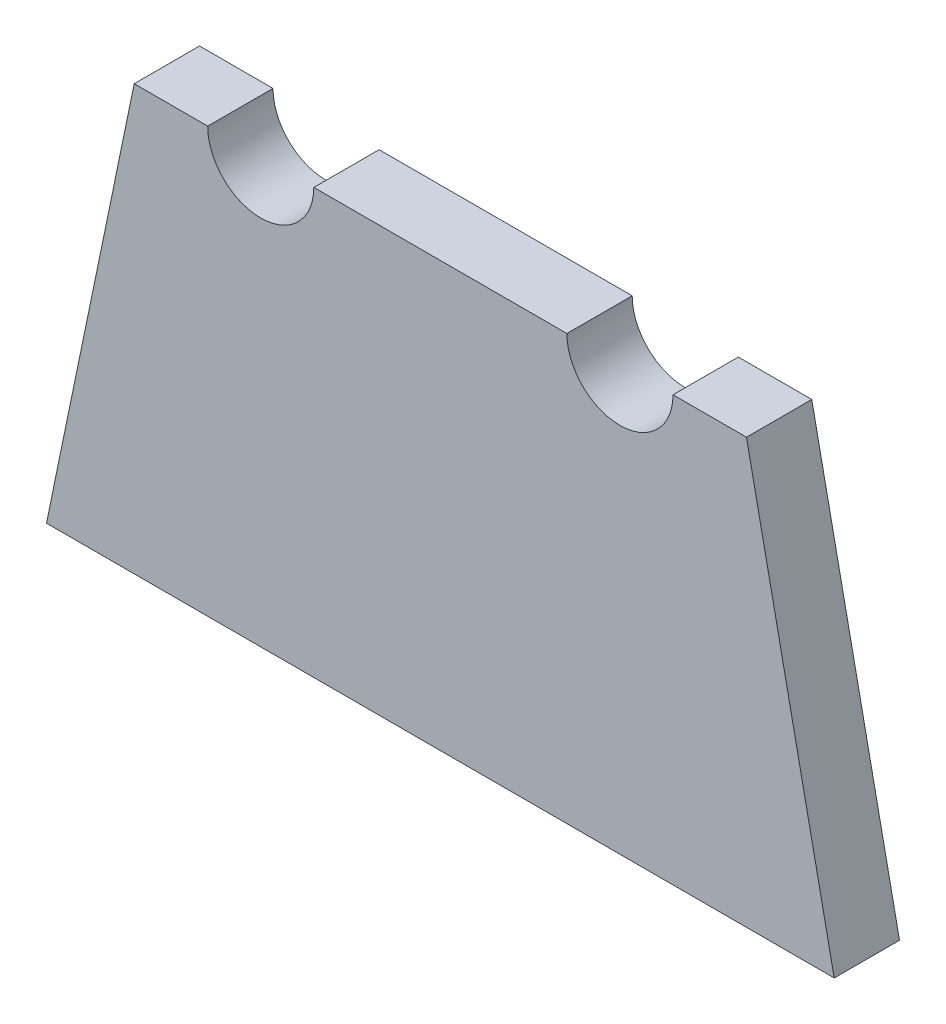
ISO-10303-21;
HEADER;
FILE_DESCRIPTION(('STEP AP214'),'2;1');
FILE_NAME('part.step','',(''),(''),'','','');
FILE_SCHEMA(('AUTOMOTIVE_DESIGN { 1 0 10303 214 1 1 1 1 }'));
ENDSEC;
DATA;
#1=APPLICATION_CONTEXT('core data for automotive mechanical design processes');
#2=APPLICATION_PROTOCOL_DEFINITION('international standard','automotive_design',2000,#1);
#3=PRODUCT_CONTEXT('',#1,'mechanical');
#4=PRODUCT('Part','Part','',(#3));
#5=PRODUCT_RELATED_PRODUCT_CATEGORY('part','',(#4));
#6=PRODUCT_DEFINITION_FORMATION('','',#4);
#7=PRODUCT_DEFINITION_CONTEXT('part definition',#1,'design');
#8=PRODUCT_DEFINITION('design','',#6,#7);
#9=PRODUCT_DEFINITION_SHAPE('','',#8);
#10=(LENGTH_UNIT() NAMED_UNIT(*) SI_UNIT(.MILLI.,.METRE.));
#11=(NAMED_UNIT(*) PLANE_ANGLE_UNIT() SI_UNIT($,.RADIAN.));
#12=(NAMED_UNIT(*) SI_UNIT($,.STERADIAN.) SOLID_ANGLE_UNIT());
#13=UNCERTAINTY_MEASURE_WITH_UNIT(LENGTH_MEASURE(1.E-05),#10,'distance_accuracy_value','');
#14=(GEOMETRIC_REPRESENTATION_CONTEXT(3) GLOBAL_UNCERTAINTY_ASSIGNED_CONTEXT((#13)) GLOBAL_UNIT_ASSIGNED_CONTEXT((#10,
#11,#12)) REPRESENTATION_CONTEXT('',''));
#15=CARTESIAN_POINT('',(0.,0.,0.));
#16=DIRECTION('',(0.,0.,1.));
#17=DIRECTION('',(1.,0.,0.));
#18=AXIS2_PLACEMENT_3D('',#15,#16,#17);
#19=CARTESIAN_POINT('',(-4.825,-2.89543156892719,0.8));
#20=DIRECTION('',(0.,1.,0.));
#21=DIRECTION('',(-1.,0.,0.));
#22=AXIS2_PLACEMENT_3D('',#19,#20,#21);
#23=PLANE('',#22);
#24=DIRECTION('',(1.,0.,0.));
#25=VECTOR('',#24,1.);
#26=CARTESIAN_POINT('',(-4.825,-2.89543156892719,0.));
#27=LINE('',#26,#25);
#28=CARTESIAN_POINT('',(-4.825,-2.89543156892719,0.));
#29=VERTEX_POINT('',#28);
#30=CARTESIAN_POINT('',(4.825,-2.89543156892719,0.));
#31=VERTEX_POINT('',#30);
#32=EDGE_CURVE('E130',#29,#31,#27,.T.);
#33=ORIENTED_EDGE('',*,*,#32,.T.);
#34=DIRECTION('',(0.,0.,-1.));
#35=VECTOR('',#34,1.);
#36=CARTESIAN_POINT('',(4.825,-2.89543156892719,0.8));
#37=LINE('',#36,#35);
#38=CARTESIAN_POINT('',(4.825,-2.89543156892719,0.8));
#39=VERTEX_POINT('',#38);
#40=EDGE_CURVE('E11',#39,#31,#37,.T.);
#41=ORIENTED_EDGE('',*,*,#40,.F.);
#42=DIRECTION('',(1.,0.,0.));
#43=VECTOR('',#42,1.);
#44=CARTESIAN_POINT('',(-4.825,-2.89543156892719,0.8));
#45=LINE('',#44,#43);
#46=CARTESIAN_POINT('',(-4.825,-2.89543156892719,0.8));
#47=VERTEX_POINT('',#46);
#48=EDGE_CURVE('E144',#47,#39,#45,.T.);
#49=ORIENTED_EDGE('',*,*,#48,.F.);
#50=DIRECTION('',(0.,0.,-1.));
#51=VECTOR('',#50,1.);
#52=CARTESIAN_POINT('',(-4.825,-2.89543156892719,0.8));
#53=LINE('',#52,#51);
#54=EDGE_CURVE('E126',#47,#29,#53,.T.);
#55=ORIENTED_EDGE('',*,*,#54,.T.);
#56=EDGE_LOOP('',(#33,#41,#49,#55));
#57=FACE_BOUND('',#56,.T.);
#58=ADVANCED_FACE('F34',(#57),#23,.F.);
#59=CARTESIAN_POINT('',(4.825,-2.89543156892719,0.8));
#60=DIRECTION('',(-0.979292617878937,-0.202449916196127,0.));
#61=DIRECTION('',(0.202449916196127,-0.979292617878937,0.));
#62=AXIS2_PLACEMENT_3D('',#59,#60,#61);
#63=PLANE('',#62);
#64=DIRECTION('',(-0.202449916196127,0.979292617878937,0.));
#65=VECTOR('',#64,1.);
#66=CARTESIAN_POINT('',(4.825,-2.89543156892719,0.));
#67=LINE('',#66,#65);
#68=CARTESIAN_POINT('',(3.75,2.30456843107281,0.));
#69=VERTEX_POINT('',#68);
#70=EDGE_CURVE('E133',#31,#69,#67,.T.);
#71=ORIENTED_EDGE('',*,*,#70,.T.);
#72=DIRECTION('',(0.,0.,-1.));
#73=VECTOR('',#72,1.);
#74=CARTESIAN_POINT('',(3.75,2.30456843107281,0.8));
#75=LINE('',#74,#73);
#76=CARTESIAN_POINT('',(3.75,2.30456843107281,0.8));
#77=VERTEX_POINT('',#76);
#78=EDGE_CURVE('E42',#77,#69,#75,.T.);
#79=ORIENTED_EDGE('',*,*,#78,.F.);
#80=DIRECTION('',(-0.202449916196127,0.979292617878937,0.));
#81=VECTOR('',#80,1.);
#82=CARTESIAN_POINT('',(4.825,-2.89543156892719,0.8));
#83=LINE('',#82,#81);
#84=EDGE_CURVE('E93',#39,#77,#83,.T.);
#85=ORIENTED_EDGE('',*,*,#84,.F.);
#86=ORIENTED_EDGE('',*,*,#40,.T.);
#87=EDGE_LOOP('',(#71,#79,#85,#86));
#88=FACE_BOUND('',#87,.T.);
#89=ADVANCED_FACE('F179',(#88),#63,.F.);
#90=CARTESIAN_POINT('',(3.75,2.30456843107281,0.8));
#91=DIRECTION('',(0.,-1.,0.));
#92=DIRECTION('',(0.,0.,-1.));
#93=AXIS2_PLACEMENT_3D('',#90,#91,#92);
#94=PLANE('',#93);
#95=DIRECTION('',(-1.,0.,0.));
#96=VECTOR('',#95,1.);
#97=CARTESIAN_POINT('',(3.75,2.30456843107281,0.));
#98=LINE('',#97,#96);
#99=CARTESIAN_POINT('',(2.85,2.30456843107281,0.));
#100=VERTEX_POINT('',#99);
#101=EDGE_CURVE('E135',#69,#100,#98,.T.);
#102=ORIENTED_EDGE('',*,*,#101,.T.);
#103=DIRECTION('',(0.,0.,-1.));
#104=VECTOR('',#103,1.);
#105=CARTESIAN_POINT('',(2.85,2.30456843107281,0.8));
#106=LINE('',#105,#104);
#107=CARTESIAN_POINT('',(2.85,2.30456843107281,0.8));
#108=VERTEX_POINT('',#107);
#109=EDGE_CURVE('E151',#108,#100,#106,.T.);
#110=ORIENTED_EDGE('',*,*,#109,.F.);
#111=DIRECTION('',(-1.,0.,0.));
#112=VECTOR('',#111,1.);
#113=CARTESIAN_POINT('',(3.75,2.30456843107281,0.8));
#114=LINE('',#113,#112);
#115=EDGE_CURVE('E159',#77,#108,#114,.T.);
#116=ORIENTED_EDGE('',*,*,#115,.F.);
#117=ORIENTED_EDGE('',*,*,#78,.T.);
#118=EDGE_LOOP('',(#102,#110,#116,#117));
#119=FACE_BOUND('',#118,.T.);
#120=ADVANCED_FACE('F157',(#119),#94,.F.);
#121=CARTESIAN_POINT('',(2.2,2.30456843107281,0.8));
#122=DIRECTION('',(0.,0.,-1.));
#123=DIRECTION('',(-1.,0.,0.));
#124=AXIS2_PLACEMENT_3D('',#121,#122,#123);
#125=CYLINDRICAL_SURFACE('',#124,0.65);
#126=CARTESIAN_POINT('',(2.2,2.30456843107281,0.));
#127=DIRECTION('',(0.,0.,-1.));
#128=DIRECTION('',(1.,0.,0.));
#129=AXIS2_PLACEMENT_3D('',#126,#127,#128);
#130=CIRCLE('',#129,0.65);
#131=CARTESIAN_POINT('',(1.55,2.30456843107281,0.));
#132=VERTEX_POINT('',#131);
#133=EDGE_CURVE('E137',#100,#132,#130,.T.);
#134=ORIENTED_EDGE('',*,*,#133,.T.);
#135=DIRECTION('',(0.,0.,-1.));
#136=VECTOR('',#135,1.);
#137=CARTESIAN_POINT('',(1.55,2.30456843107281,0.8));
#138=LINE('',#137,#136);
#139=CARTESIAN_POINT('',(1.55,2.30456843107281,0.8));
#140=VERTEX_POINT('',#139);
#141=EDGE_CURVE('E148',#140,#132,#138,.T.);
#142=ORIENTED_EDGE('',*,*,#141,.F.);
#143=CARTESIAN_POINT('',(2.2,2.30456843107281,0.8));
#144=DIRECTION('',(0.,0.,-1.));
#145=DIRECTION('',(1.,0.,0.));
#146=AXIS2_PLACEMENT_3D('',#143,#144,#145);
#147=CIRCLE('',#146,0.65);
#148=EDGE_CURVE('E171',#108,#140,#147,.T.);
#149=ORIENTED_EDGE('',*,*,#148,.F.);
#150=ORIENTED_EDGE('',*,*,#109,.T.);
#151=EDGE_LOOP('',(#134,#142,#149,#150));
#152=FACE_BOUND('',#151,.T.);
#153=ADVANCED_FACE('F167',(#152),#125,.F.);
#154=CARTESIAN_POINT('',(1.55,2.30456843107281,0.8));
#155=DIRECTION('',(0.,-1.,0.));
#156=DIRECTION('',(0.,0.,-1.));
#157=AXIS2_PLACEMENT_3D('',#154,#155,#156);
#158=PLANE('',#157);
#159=DIRECTION('',(-1.,0.,0.));
#160=VECTOR('',#159,1.);
#161=CARTESIAN_POINT('',(1.55,2.30456843107281,0.));
#162=LINE('',#161,#160);
#163=CARTESIAN_POINT('',(-1.55,2.30456843107281,0.));
#164=VERTEX_POINT('',#163);
#165=EDGE_CURVE('E139',#132,#164,#162,.T.);
#166=ORIENTED_EDGE('',*,*,#165,.T.);
#167=DIRECTION('',(0.,0.,-1.));
#168=VECTOR('',#167,1.);
#169=CARTESIAN_POINT('',(-1.55,2.30456843107281,0.8));
#170=LINE('',#169,#168);
#171=CARTESIAN_POINT('',(-1.55,2.30456843107281,0.8));
#172=VERTEX_POINT('',#171);
#173=EDGE_CURVE('E121',#172,#164,#170,.T.);
#174=ORIENTED_EDGE('',*,*,#173,.F.);
#175=DIRECTION('',(-1.,0.,0.));
#176=VECTOR('',#175,1.);
#177=CARTESIAN_POINT('',(1.55,2.30456843107281,0.8));
#178=LINE('',#177,#176);
#179=EDGE_CURVE('E112',#140,#172,#178,.T.);
#180=ORIENTED_EDGE('',*,*,#179,.F.);
#181=ORIENTED_EDGE('',*,*,#141,.T.);
#182=EDGE_LOOP('',(#166,#174,#180,#181));
#183=FACE_BOUND('',#182,.T.);
#184=ADVANCED_FACE('F170',(#183),#158,.F.);
#185=CARTESIAN_POINT('',(-2.2,2.30456843107281,0.8));
#186=DIRECTION('',(0.,0.,-1.));
#187=DIRECTION('',(-1.,0.,0.));
#188=AXIS2_PLACEMENT_3D('',#185,#186,#187);
#189=CYLINDRICAL_SURFACE('',#188,0.65);
#190=CARTESIAN_POINT('',(-2.2,2.30456843107281,0.));
#191=DIRECTION('',(0.,0.,-1.));
#192=DIRECTION('',(-1.,0.,0.));
#193=AXIS2_PLACEMENT_3D('',#190,#191,#192);
#194=CIRCLE('',#193,0.65);
#195=CARTESIAN_POINT('',(-2.85,2.30456843107281,0.));
#196=VERTEX_POINT('',#195);
#197=EDGE_CURVE('E120',#164,#196,#194,.T.);
#198=ORIENTED_EDGE('',*,*,#197,.T.);
#199=DIRECTION('',(0.,0.,-1.));
#200=VECTOR('',#199,1.);
#201=CARTESIAN_POINT('',(-2.85,2.30456843107281,0.8));
#202=LINE('',#201,#200);
#203=CARTESIAN_POINT('',(-2.85,2.30456843107281,0.8));
#204=VERTEX_POINT('',#203);
#205=EDGE_CURVE('E117',#204,#196,#202,.T.);
#206=ORIENTED_EDGE('',*,*,#205,.F.);
#207=CARTESIAN_POINT('',(-2.2,2.30456843107281,0.8));
#208=DIRECTION('',(0.,0.,-1.));
#209=DIRECTION('',(-1.,0.,0.));
#210=AXIS2_PLACEMENT_3D('',#207,#208,#209);
#211=CIRCLE('',#210,0.65);
#212=EDGE_CURVE('E106',#172,#204,#211,.T.);
#213=ORIENTED_EDGE('',*,*,#212,.F.);
#214=ORIENTED_EDGE('',*,*,#173,.T.);
#215=EDGE_LOOP('',(#198,#206,#213,#214));
#216=FACE_BOUND('',#215,.T.);
#217=ADVANCED_FACE('F118',(#216),#189,.F.);
#218=CARTESIAN_POINT('',(-2.85,2.30456843107281,0.8));
#219=DIRECTION('',(0.,-1.,0.));
#220=DIRECTION('',(0.,0.,-1.));
#221=AXIS2_PLACEMENT_3D('',#218,#219,#220);
#222=PLANE('',#221);
#223=DIRECTION('',(-1.,0.,0.));
#224=VECTOR('',#223,1.);
#225=CARTESIAN_POINT('',(-2.85,2.30456843107281,0.));
#226=LINE('',#225,#224);
#227=CARTESIAN_POINT('',(-3.75,2.30456843107281,0.));
#228=VERTEX_POINT('',#227);
#229=EDGE_CURVE('E79',#196,#228,#226,.T.);
#230=ORIENTED_EDGE('',*,*,#229,.T.);
#231=DIRECTION('',(0.,0.,-1.));
#232=VECTOR('',#231,1.);
#233=CARTESIAN_POINT('',(-3.75,2.30456843107281,0.8));
#234=LINE('',#233,#232);
#235=CARTESIAN_POINT('',(-3.75,2.30456843107281,0.8));
#236=VERTEX_POINT('',#235);
#237=EDGE_CURVE('E122',#236,#228,#234,.T.);
#238=ORIENTED_EDGE('',*,*,#237,.F.);
#239=DIRECTION('',(-1.,0.,0.));
#240=VECTOR('',#239,1.);
#241=CARTESIAN_POINT('',(-2.85,2.30456843107281,0.8));
#242=LINE('',#241,#240);
#243=EDGE_CURVE('E110',#204,#236,#242,.T.);
#244=ORIENTED_EDGE('',*,*,#243,.F.);
#245=ORIENTED_EDGE('',*,*,#205,.T.);
#246=EDGE_LOOP('',(#230,#238,#244,#245));
#247=FACE_BOUND('',#246,.T.);
#248=ADVANCED_FACE('F124',(#247),#222,.F.);
#249=CARTESIAN_POINT('',(-3.75,2.30456843107281,0.8));
#250=DIRECTION('',(0.979292617878937,-0.202449916196126,0.));
#251=DIRECTION('',(0.202449916196126,0.979292617878937,0.));
#252=AXIS2_PLACEMENT_3D('',#249,#250,#251);
#253=PLANE('',#252);
#254=DIRECTION('',(-0.202449916196126,-0.979292617878937,0.));
#255=VECTOR('',#254,1.);
#256=CARTESIAN_POINT('',(-3.75,2.30456843107281,0.));
#257=LINE('',#256,#255);
#258=EDGE_CURVE('E85',#228,#29,#257,.T.);
#259=ORIENTED_EDGE('',*,*,#258,.T.);
#260=ORIENTED_EDGE('',*,*,#54,.F.);
#261=DIRECTION('',(-0.202449916196126,-0.979292617878937,0.));
#262=VECTOR('',#261,1.);
#263=CARTESIAN_POINT('',(-3.75,2.30456843107281,0.8));
#264=LINE('',#263,#262);
#265=EDGE_CURVE('E50',#236,#47,#264,.T.);
#266=ORIENTED_EDGE('',*,*,#265,.F.);
#267=ORIENTED_EDGE('',*,*,#237,.T.);
#268=EDGE_LOOP('',(#259,#260,#266,#267));
#269=FACE_BOUND('',#268,.T.);
#270=ADVANCED_FACE('F195',(#269),#253,.F.);
#271=CARTESIAN_POINT('',(2.2,2.30456843107281,0.8));
#272=DIRECTION('',(0.,0.,1.));
#273=DIRECTION('',(1.,0.,0.));
#274=AXIS2_PLACEMENT_3D('',#271,#272,#273);
#275=PLANE('',#274);
#276=ORIENTED_EDGE('',*,*,#48,.T.);
#277=ORIENTED_EDGE('',*,*,#84,.T.);
#278=ORIENTED_EDGE('',*,*,#115,.T.);
#279=ORIENTED_EDGE('',*,*,#148,.T.);
#280=ORIENTED_EDGE('',*,*,#179,.T.);
#281=ORIENTED_EDGE('',*,*,#212,.T.);
#282=ORIENTED_EDGE('',*,*,#243,.T.);
#283=ORIENTED_EDGE('',*,*,#265,.T.);
#284=EDGE_LOOP('',(#276,#277,#278,#279,#280,#281,#282,#283));
#285=FACE_BOUND('',#284,.T.);
#286=ADVANCED_FACE('F108',(#285),#275,.T.);
#287=CARTESIAN_POINT('',(2.2,2.30456843107281,0.));
#288=DIRECTION('',(0.,0.,1.));
#289=DIRECTION('',(1.,0.,0.));
#290=AXIS2_PLACEMENT_3D('',#287,#288,#289);
#291=PLANE('',#290);
#292=ORIENTED_EDGE('',*,*,#32,.F.);
#293=ORIENTED_EDGE('',*,*,#258,.F.);
#294=ORIENTED_EDGE('',*,*,#229,.F.);
#295=ORIENTED_EDGE('',*,*,#197,.F.);
#296=ORIENTED_EDGE('',*,*,#165,.F.);
#297=ORIENTED_EDGE('',*,*,#133,.F.);
#298=ORIENTED_EDGE('',*,*,#101,.F.);
#299=ORIENTED_EDGE('',*,*,#70,.F.);
#300=EDGE_LOOP('',(#292,#293,#294,#295,#296,#297,#298,#299));
#301=FACE_BOUND('',#300,.T.);
#302=ADVANCED_FACE('F163',(#301),#291,.F.);
#303=CLOSED_SHELL('',(#58,#89,#120,#153,#184,#217,#248,#270,#286,#302));
#304=MANIFOLD_SOLID_BREP('B2',#303);
#305=ADVANCED_BREP_SHAPE_REPRESENTATION('',(#18,#304),#14);
#306=SHAPE_DEFINITION_REPRESENTATION(#9,#305);
ENDSEC;
END-ISO-10303-21;
